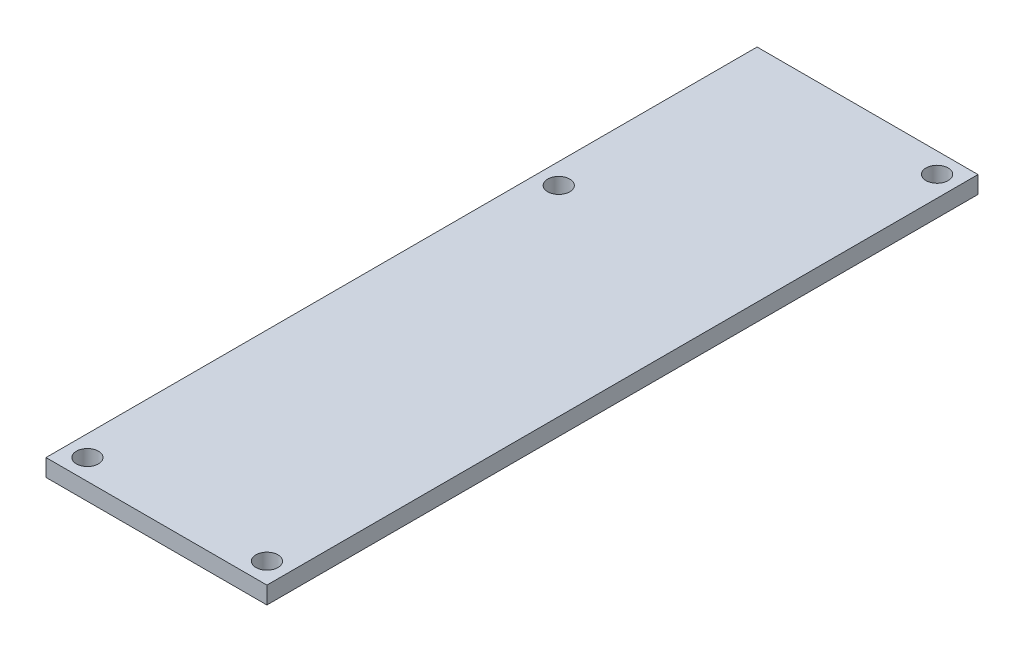
ISO-10303-21;
HEADER;
FILE_DESCRIPTION(('STEP AP214'),'2;1');
FILE_NAME('part.step','',(''),(''),'','','');
FILE_SCHEMA(('AUTOMOTIVE_DESIGN { 1 0 10303 214 1 1 1 1 }'));
ENDSEC;
DATA;
#1=APPLICATION_CONTEXT('core data for automotive mechanical design processes');
#2=APPLICATION_PROTOCOL_DEFINITION('international standard','automotive_design',2000,#1);
#3=PRODUCT_CONTEXT('',#1,'mechanical');
#4=PRODUCT('Part','Part','',(#3));
#5=PRODUCT_RELATED_PRODUCT_CATEGORY('part','',(#4));
#6=PRODUCT_DEFINITION_FORMATION('','',#4);
#7=PRODUCT_DEFINITION_CONTEXT('part definition',#1,'design');
#8=PRODUCT_DEFINITION('design','',#6,#7);
#9=PRODUCT_DEFINITION_SHAPE('','',#8);
#10=(LENGTH_UNIT() NAMED_UNIT(*) SI_UNIT(.MILLI.,.METRE.));
#11=(NAMED_UNIT(*) PLANE_ANGLE_UNIT() SI_UNIT($,.RADIAN.));
#12=(NAMED_UNIT(*) SI_UNIT($,.STERADIAN.) SOLID_ANGLE_UNIT());
#13=UNCERTAINTY_MEASURE_WITH_UNIT(LENGTH_MEASURE(1.E-05),#10,'distance_accuracy_value','');
#14=(GEOMETRIC_REPRESENTATION_CONTEXT(3) GLOBAL_UNCERTAINTY_ASSIGNED_CONTEXT((#13)) GLOBAL_UNIT_ASSIGNED_CONTEXT((#10,
#11,#12)) REPRESENTATION_CONTEXT('',''));
#15=CARTESIAN_POINT('',(0.,0.,0.));
#16=DIRECTION('',(0.,0.,1.));
#17=DIRECTION('',(1.,0.,0.));
#18=AXIS2_PLACEMENT_3D('',#15,#16,#17);
#19=CARTESIAN_POINT('',(0.,2.5,0.));
#20=DIRECTION('',(0.,-1.,0.));
#21=DIRECTION('',(0.,0.,-1.));
#22=AXIS2_PLACEMENT_3D('',#19,#20,#21);
#23=PLANE('',#22);
#24=DIRECTION('',(0.,0.,1.));
#25=VECTOR('',#24,1.);
#26=CARTESIAN_POINT('',(0.,2.5,0.));
#27=LINE('',#26,#25);
#28=CARTESIAN_POINT('',(0.,2.5,-103.));
#29=VERTEX_POINT('',#28);
#30=CARTESIAN_POINT('',(0.,2.5,0.));
#31=VERTEX_POINT('',#30);
#32=EDGE_CURVE('E92',#29,#31,#27,.T.);
#33=ORIENTED_EDGE('',*,*,#32,.T.);
#34=DIRECTION('',(1.,0.,0.));
#35=VECTOR('',#34,1.);
#36=CARTESIAN_POINT('',(0.,2.5,0.));
#37=LINE('',#36,#35);
#38=CARTESIAN_POINT('',(32.,2.5,0.));
#39=VERTEX_POINT('',#38);
#40=EDGE_CURVE('E87',#31,#39,#37,.T.);
#41=ORIENTED_EDGE('',*,*,#40,.T.);
#42=DIRECTION('',(0.,0.,-1.));
#43=VECTOR('',#42,1.);
#44=CARTESIAN_POINT('',(32.,2.5,0.));
#45=LINE('',#44,#43);
#46=CARTESIAN_POINT('',(32.,2.5,-103.));
#47=VERTEX_POINT('',#46);
#48=EDGE_CURVE('E90',#39,#47,#45,.T.);
#49=ORIENTED_EDGE('',*,*,#48,.T.);
#50=DIRECTION('',(-1.,0.,0.));
#51=VECTOR('',#50,1.);
#52=CARTESIAN_POINT('',(0.,2.5,-103.));
#53=LINE('',#52,#51);
#54=EDGE_CURVE('E57',#47,#29,#53,.T.);
#55=ORIENTED_EDGE('',*,*,#54,.T.);
#56=EDGE_LOOP('',(#33,#41,#49,#55));
#57=FACE_BOUND('',#56,.T.);
#58=CARTESIAN_POINT('',(29.,2.5,-3.00000000000001));
#59=DIRECTION('',(0.,1.,0.));
#60=DIRECTION('',(0.,0.,1.));
#61=AXIS2_PLACEMENT_3D('',#58,#59,#60);
#62=CIRCLE('',#61,1.6);
#63=CARTESIAN_POINT('',(29.,2.5,-1.4));
#64=VERTEX_POINT('',#63);
#65=EDGE_CURVE('E112',#64,#64,#62,.T.);
#66=ORIENTED_EDGE('',*,*,#65,.F.);
#67=EDGE_LOOP('',(#66));
#68=FACE_BOUND('',#67,.T.);
#69=CARTESIAN_POINT('',(3.,2.5,-3.));
#70=DIRECTION('',(0.,1.,0.));
#71=DIRECTION('',(0.,0.,1.));
#72=AXIS2_PLACEMENT_3D('',#69,#70,#71);
#73=CIRCLE('',#72,1.6);
#74=CARTESIAN_POINT('',(3.,2.5,-1.4));
#75=VERTEX_POINT('',#74);
#76=EDGE_CURVE('E134',#75,#75,#73,.T.);
#77=ORIENTED_EDGE('',*,*,#76,.F.);
#78=EDGE_LOOP('',(#77));
#79=FACE_BOUND('',#78,.T.);
#80=CARTESIAN_POINT('',(3.,2.5,-71.27));
#81=DIRECTION('',(0.,1.,0.));
#82=DIRECTION('',(0.,0.,1.));
#83=AXIS2_PLACEMENT_3D('',#80,#81,#82);
#84=CIRCLE('',#83,1.6);
#85=CARTESIAN_POINT('',(3.,2.5,-69.67));
#86=VERTEX_POINT('',#85);
#87=EDGE_CURVE('E142',#86,#86,#84,.T.);
#88=ORIENTED_EDGE('',*,*,#87,.F.);
#89=EDGE_LOOP('',(#88));
#90=FACE_BOUND('',#89,.T.);
#91=CARTESIAN_POINT('',(29.,2.5,-100.07));
#92=DIRECTION('',(0.,1.,0.));
#93=DIRECTION('',(0.,0.,1.));
#94=AXIS2_PLACEMENT_3D('',#91,#92,#93);
#95=CIRCLE('',#94,1.6);
#96=CARTESIAN_POINT('',(29.,2.5,-98.47));
#97=VERTEX_POINT('',#96);
#98=EDGE_CURVE('E150',#97,#97,#95,.T.);
#99=ORIENTED_EDGE('',*,*,#98,.F.);
#100=EDGE_LOOP('',(#99));
#101=FACE_BOUND('',#100,.T.);
#102=ADVANCED_FACE('F39',(#57,#68,#79,#90,#101),#23,.F.);
#103=CARTESIAN_POINT('',(0.,0.,0.));
#104=DIRECTION('',(0.,-1.,0.));
#105=DIRECTION('',(0.,0.,-1.));
#106=AXIS2_PLACEMENT_3D('',#103,#104,#105);
#107=PLANE('',#106);
#108=CARTESIAN_POINT('',(3.,0.,-71.27));
#109=DIRECTION('',(0.,1.,0.));
#110=DIRECTION('',(0.,0.,1.));
#111=AXIS2_PLACEMENT_3D('',#108,#109,#110);
#112=CIRCLE('',#111,1.6);
#113=CARTESIAN_POINT('',(3.,0.,-69.67));
#114=VERTEX_POINT('',#113);
#115=EDGE_CURVE('E146',#114,#114,#112,.T.);
#116=ORIENTED_EDGE('',*,*,#115,.T.);
#117=EDGE_LOOP('',(#116));
#118=FACE_BOUND('',#117,.T.);
#119=CARTESIAN_POINT('',(29.,0.,-3.00000000000001));
#120=DIRECTION('',(0.,1.,0.));
#121=DIRECTION('',(0.,0.,1.));
#122=AXIS2_PLACEMENT_3D('',#119,#120,#121);
#123=CIRCLE('',#122,1.6);
#124=CARTESIAN_POINT('',(29.,0.,-1.4));
#125=VERTEX_POINT('',#124);
#126=EDGE_CURVE('E130',#125,#125,#123,.T.);
#127=ORIENTED_EDGE('',*,*,#126,.T.);
#128=EDGE_LOOP('',(#127));
#129=FACE_BOUND('',#128,.T.);
#130=DIRECTION('',(0.,0.,1.));
#131=VECTOR('',#130,1.);
#132=CARTESIAN_POINT('',(0.,0.,0.));
#133=LINE('',#132,#131);
#134=CARTESIAN_POINT('',(0.,0.,-103.));
#135=VERTEX_POINT('',#134);
#136=CARTESIAN_POINT('',(0.,0.,0.));
#137=VERTEX_POINT('',#136);
#138=EDGE_CURVE('E108',#135,#137,#133,.T.);
#139=ORIENTED_EDGE('',*,*,#138,.F.);
#140=DIRECTION('',(-1.,0.,0.));
#141=VECTOR('',#140,1.);
#142=CARTESIAN_POINT('',(0.,0.,-103.));
#143=LINE('',#142,#141);
#144=CARTESIAN_POINT('',(32.,0.,-103.));
#145=VERTEX_POINT('',#144);
#146=EDGE_CURVE('E80',#145,#135,#143,.T.);
#147=ORIENTED_EDGE('',*,*,#146,.F.);
#148=DIRECTION('',(0.,0.,-1.));
#149=VECTOR('',#148,1.);
#150=CARTESIAN_POINT('',(32.,0.,0.));
#151=LINE('',#150,#149);
#152=CARTESIAN_POINT('',(32.,0.,0.));
#153=VERTEX_POINT('',#152);
#154=EDGE_CURVE('E74',#153,#145,#151,.T.);
#155=ORIENTED_EDGE('',*,*,#154,.F.);
#156=DIRECTION('',(1.,0.,0.));
#157=VECTOR('',#156,1.);
#158=CARTESIAN_POINT('',(0.,0.,0.));
#159=LINE('',#158,#157);
#160=EDGE_CURVE('E97',#137,#153,#159,.T.);
#161=ORIENTED_EDGE('',*,*,#160,.F.);
#162=EDGE_LOOP('',(#139,#147,#155,#161));
#163=FACE_BOUND('',#162,.T.);
#164=CARTESIAN_POINT('',(3.,0.,-3.));
#165=DIRECTION('',(0.,1.,0.));
#166=DIRECTION('',(0.,0.,1.));
#167=AXIS2_PLACEMENT_3D('',#164,#165,#166);
#168=CIRCLE('',#167,1.6);
#169=CARTESIAN_POINT('',(3.,0.,-1.4));
#170=VERTEX_POINT('',#169);
#171=EDGE_CURVE('E138',#170,#170,#168,.T.);
#172=ORIENTED_EDGE('',*,*,#171,.T.);
#173=EDGE_LOOP('',(#172));
#174=FACE_BOUND('',#173,.T.);
#175=CARTESIAN_POINT('',(29.,0.,-100.07));
#176=DIRECTION('',(0.,1.,0.));
#177=DIRECTION('',(0.,0.,1.));
#178=AXIS2_PLACEMENT_3D('',#175,#176,#177);
#179=CIRCLE('',#178,1.6);
#180=CARTESIAN_POINT('',(29.,0.,-98.47));
#181=VERTEX_POINT('',#180);
#182=EDGE_CURVE('E154',#181,#181,#179,.T.);
#183=ORIENTED_EDGE('',*,*,#182,.T.);
#184=EDGE_LOOP('',(#183));
#185=FACE_BOUND('',#184,.T.);
#186=ADVANCED_FACE('F125',(#118,#129,#163,#174,#185),#107,.T.);
#187=CARTESIAN_POINT('',(0.,2.5,0.));
#188=DIRECTION('',(1.,0.,0.));
#189=DIRECTION('',(0.,0.,-1.));
#190=AXIS2_PLACEMENT_3D('',#187,#188,#189);
#191=PLANE('',#190);
#192=ORIENTED_EDGE('',*,*,#138,.T.);
#193=DIRECTION('',(0.,-1.,0.));
#194=VECTOR('',#193,1.);
#195=CARTESIAN_POINT('',(0.,2.5,0.));
#196=LINE('',#195,#194);
#197=EDGE_CURVE('E11',#31,#137,#196,.T.);
#198=ORIENTED_EDGE('',*,*,#197,.F.);
#199=ORIENTED_EDGE('',*,*,#32,.F.);
#200=DIRECTION('',(0.,-1.,0.));
#201=VECTOR('',#200,1.);
#202=CARTESIAN_POINT('',(0.,2.5,-103.));
#203=LINE('',#202,#201);
#204=EDGE_CURVE('E104',#29,#135,#203,.T.);
#205=ORIENTED_EDGE('',*,*,#204,.T.);
#206=EDGE_LOOP('',(#192,#198,#199,#205));
#207=FACE_BOUND('',#206,.T.);
#208=ADVANCED_FACE('F41',(#207),#191,.F.);
#209=CARTESIAN_POINT('',(0.,2.5,0.));
#210=DIRECTION('',(0.,0.,-1.));
#211=DIRECTION('',(-1.,0.,0.));
#212=AXIS2_PLACEMENT_3D('',#209,#210,#211);
#213=PLANE('',#212);
#214=ORIENTED_EDGE('',*,*,#160,.T.);
#215=DIRECTION('',(0.,-1.,0.));
#216=VECTOR('',#215,1.);
#217=CARTESIAN_POINT('',(32.,2.5,0.));
#218=LINE('',#217,#216);
#219=EDGE_CURVE('E49',#39,#153,#218,.T.);
#220=ORIENTED_EDGE('',*,*,#219,.F.);
#221=ORIENTED_EDGE('',*,*,#40,.F.);
#222=ORIENTED_EDGE('',*,*,#197,.T.);
#223=EDGE_LOOP('',(#214,#220,#221,#222));
#224=FACE_BOUND('',#223,.T.);
#225=ADVANCED_FACE('F96',(#224),#213,.F.);
#226=CARTESIAN_POINT('',(32.,2.5,0.));
#227=DIRECTION('',(-1.,0.,0.));
#228=DIRECTION('',(0.,0.,1.));
#229=AXIS2_PLACEMENT_3D('',#226,#227,#228);
#230=PLANE('',#229);
#231=ORIENTED_EDGE('',*,*,#154,.T.);
#232=DIRECTION('',(0.,-1.,0.));
#233=VECTOR('',#232,1.);
#234=CARTESIAN_POINT('',(32.,2.5,-103.));
#235=LINE('',#234,#233);
#236=EDGE_CURVE('E99',#47,#145,#235,.T.);
#237=ORIENTED_EDGE('',*,*,#236,.F.);
#238=ORIENTED_EDGE('',*,*,#48,.F.);
#239=ORIENTED_EDGE('',*,*,#219,.T.);
#240=EDGE_LOOP('',(#231,#237,#238,#239));
#241=FACE_BOUND('',#240,.T.);
#242=ADVANCED_FACE('F100',(#241),#230,.F.);
#243=CARTESIAN_POINT('',(0.,2.5,-103.));
#244=DIRECTION('',(0.,0.,1.));
#245=DIRECTION('',(1.,0.,0.));
#246=AXIS2_PLACEMENT_3D('',#243,#244,#245);
#247=PLANE('',#246);
#248=ORIENTED_EDGE('',*,*,#146,.T.);
#249=ORIENTED_EDGE('',*,*,#204,.F.);
#250=ORIENTED_EDGE('',*,*,#54,.F.);
#251=ORIENTED_EDGE('',*,*,#236,.T.);
#252=EDGE_LOOP('',(#248,#249,#250,#251));
#253=FACE_BOUND('',#252,.T.);
#254=ADVANCED_FACE('F122',(#253),#247,.F.);
#255=CARTESIAN_POINT('',(29.,2.5,-3.00000000000001));
#256=DIRECTION('',(0.,-1.,0.));
#257=DIRECTION('',(0.,0.,-1.));
#258=AXIS2_PLACEMENT_3D('',#255,#256,#257);
#259=CYLINDRICAL_SURFACE('',#258,1.6);
#260=ORIENTED_EDGE('',*,*,#65,.T.);
#261=EDGE_LOOP('',(#260));
#262=FACE_BOUND('',#261,.T.);
#263=ORIENTED_EDGE('',*,*,#126,.F.);
#264=EDGE_LOOP('',(#263));
#265=FACE_BOUND('',#264,.T.);
#266=ADVANCED_FACE('F173',(#262,#265),#259,.F.);
#267=CARTESIAN_POINT('',(3.,2.5,-3.));
#268=DIRECTION('',(0.,-1.,0.));
#269=DIRECTION('',(0.,0.,-1.));
#270=AXIS2_PLACEMENT_3D('',#267,#268,#269);
#271=CYLINDRICAL_SURFACE('',#270,1.6);
#272=ORIENTED_EDGE('',*,*,#76,.T.);
#273=EDGE_LOOP('',(#272));
#274=FACE_BOUND('',#273,.T.);
#275=ORIENTED_EDGE('',*,*,#171,.F.);
#276=EDGE_LOOP('',(#275));
#277=FACE_BOUND('',#276,.T.);
#278=ADVANCED_FACE('F219',(#274,#277),#271,.F.);
#279=CARTESIAN_POINT('',(3.,2.5,-71.27));
#280=DIRECTION('',(0.,-1.,0.));
#281=DIRECTION('',(0.,0.,-1.));
#282=AXIS2_PLACEMENT_3D('',#279,#280,#281);
#283=CYLINDRICAL_SURFACE('',#282,1.6);
#284=ORIENTED_EDGE('',*,*,#87,.T.);
#285=EDGE_LOOP('',(#284));
#286=FACE_BOUND('',#285,.T.);
#287=ORIENTED_EDGE('',*,*,#115,.F.);
#288=EDGE_LOOP('',(#287));
#289=FACE_BOUND('',#288,.T.);
#290=ADVANCED_FACE('F227',(#286,#289),#283,.F.);
#291=CARTESIAN_POINT('',(29.,2.5,-100.07));
#292=DIRECTION('',(0.,-1.,0.));
#293=DIRECTION('',(0.,0.,-1.));
#294=AXIS2_PLACEMENT_3D('',#291,#292,#293);
#295=CYLINDRICAL_SURFACE('',#294,1.6);
#296=ORIENTED_EDGE('',*,*,#98,.T.);
#297=EDGE_LOOP('',(#296));
#298=FACE_BOUND('',#297,.T.);
#299=ORIENTED_EDGE('',*,*,#182,.F.);
#300=EDGE_LOOP('',(#299));
#301=FACE_BOUND('',#300,.T.);
#302=ADVANCED_FACE('F162',(#298,#301),#295,.F.);
#303=CLOSED_SHELL('',(#102,#186,#208,#225,#242,#254,#266,#278,#290,#302));
#304=MANIFOLD_SOLID_BREP('B2',#303);
#305=ADVANCED_BREP_SHAPE_REPRESENTATION('',(#18,#304),#14);
#306=SHAPE_DEFINITION_REPRESENTATION(#9,#305);
ENDSEC;
END-ISO-10303-21;
